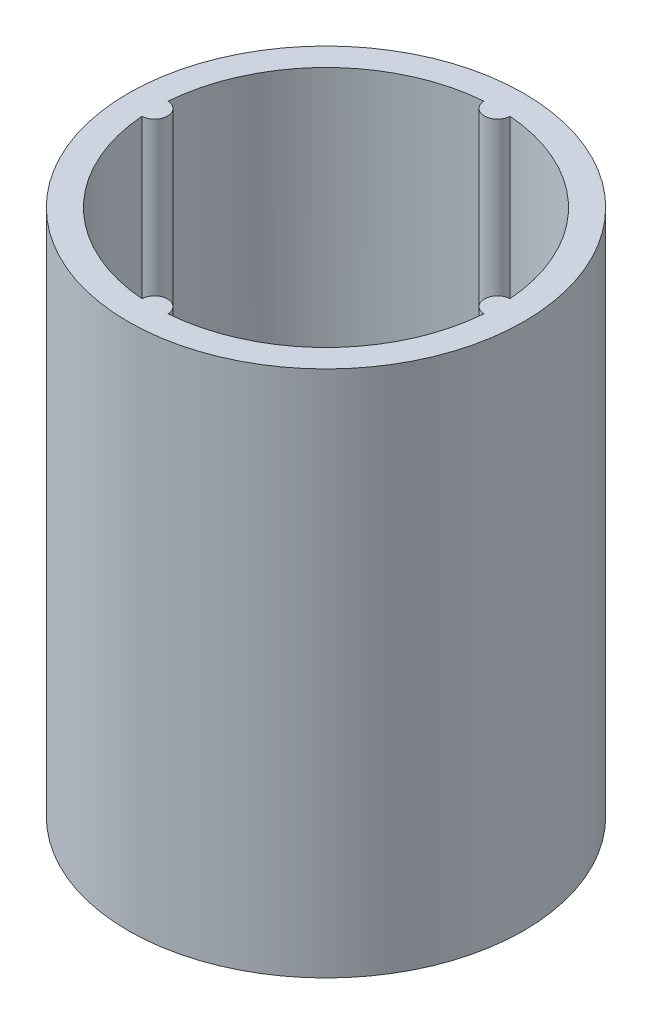
ISO-10303-21;
HEADER;
FILE_DESCRIPTION(('STEP AP214'),'2;1');
FILE_NAME('part.step','',(''),(''),'','','');
FILE_SCHEMA(('AUTOMOTIVE_DESIGN { 1 0 10303 214 1 1 1 1 }'));
ENDSEC;
DATA;
#1=APPLICATION_CONTEXT('core data for automotive mechanical design processes');
#2=APPLICATION_PROTOCOL_DEFINITION('international standard','automotive_design',2000,#1);
#3=PRODUCT_CONTEXT('',#1,'mechanical');
#4=PRODUCT('Part','Part','',(#3));
#5=PRODUCT_RELATED_PRODUCT_CATEGORY('part','',(#4));
#6=PRODUCT_DEFINITION_FORMATION('','',#4);
#7=PRODUCT_DEFINITION_CONTEXT('part definition',#1,'design');
#8=PRODUCT_DEFINITION('design','',#6,#7);
#9=PRODUCT_DEFINITION_SHAPE('','',#8);
#10=(LENGTH_UNIT() NAMED_UNIT(*) SI_UNIT(.MILLI.,.METRE.));
#11=(NAMED_UNIT(*) PLANE_ANGLE_UNIT() SI_UNIT($,.RADIAN.));
#12=(NAMED_UNIT(*) SI_UNIT($,.STERADIAN.) SOLID_ANGLE_UNIT());
#13=UNCERTAINTY_MEASURE_WITH_UNIT(LENGTH_MEASURE(1.E-05),#10,'distance_accuracy_value','');
#14=(GEOMETRIC_REPRESENTATION_CONTEXT(3) GLOBAL_UNCERTAINTY_ASSIGNED_CONTEXT((#13)) GLOBAL_UNIT_ASSIGNED_CONTEXT((#10,
#11,#12)) REPRESENTATION_CONTEXT('',''));
#15=CARTESIAN_POINT('',(0.,0.,0.));
#16=DIRECTION('',(0.,0.,1.));
#17=DIRECTION('',(1.,0.,0.));
#18=AXIS2_PLACEMENT_3D('',#15,#16,#17);
#19=CARTESIAN_POINT('',(0.,80.,0.));
#20=DIRECTION('',(0.,-1.,0.));
#21=DIRECTION('',(0.,0.,-1.));
#22=AXIS2_PLACEMENT_3D('',#19,#20,#21);
#23=CYLINDRICAL_SURFACE('',#22,30.);
#24=DIRECTION('',(0.,-1.,0.));
#25=VECTOR('',#24,1.);
#26=CARTESIAN_POINT('',(-22.3606797749979,80.,-20.));
#27=LINE('',#26,#25);
#28=CARTESIAN_POINT('',(-22.3606797749979,1.12434253433368,-20.));
#29=VERTEX_POINT('',#28);
#30=CARTESIAN_POINT('',(-22.3606797749979,11.1243425343337,-20.));
#31=VERTEX_POINT('',#30);
#32=EDGE_CURVE('E210',#29,#31,#27,.F.);
#33=ORIENTED_EDGE('',*,*,#32,.T.);
#34=CARTESIAN_POINT('',(0.,11.1243425343337,0.));
#35=DIRECTION('',(0.,1.,0.));
#36=DIRECTION('',(0.,0.,1.));
#37=AXIS2_PLACEMENT_3D('',#34,#35,#36);
#38=CIRCLE('',#37,30.);
#39=CARTESIAN_POINT('',(-22.3606797749979,11.1243425343337,20.));
#40=VERTEX_POINT('',#39);
#41=EDGE_CURVE('E213',#31,#40,#38,.T.);
#42=ORIENTED_EDGE('',*,*,#41,.T.);
#43=DIRECTION('',(0.,-1.,0.));
#44=VECTOR('',#43,1.);
#45=CARTESIAN_POINT('',(-22.3606797749979,80.,20.));
#46=LINE('',#45,#44);
#47=CARTESIAN_POINT('',(-22.3606797749979,1.12434253433367,20.));
#48=VERTEX_POINT('',#47);
#49=EDGE_CURVE('E204',#40,#48,#46,.T.);
#50=ORIENTED_EDGE('',*,*,#49,.T.);
#51=CARTESIAN_POINT('',(0.,1.12434253433368,0.));
#52=DIRECTION('',(0.,-1.,0.));
#53=DIRECTION('',(0.,0.,-1.));
#54=AXIS2_PLACEMENT_3D('',#51,#52,#53);
#55=CIRCLE('',#54,30.);
#56=EDGE_CURVE('E234',#48,#29,#55,.T.);
#57=ORIENTED_EDGE('',*,*,#56,.T.);
#58=EDGE_LOOP('',(#33,#42,#50,#57));
#59=FACE_BOUND('',#58,.T.);
#60=CARTESIAN_POINT('',(0.,80.,0.));
#61=DIRECTION('',(0.,1.,0.));
#62=DIRECTION('',(0.,0.,1.));
#63=AXIS2_PLACEMENT_3D('',#60,#61,#62);
#64=CIRCLE('',#63,30.);
#65=CARTESIAN_POINT('',(0.,80.,30.));
#66=VERTEX_POINT('',#65);
#67=EDGE_CURVE('E219',#66,#66,#64,.T.);
#68=ORIENTED_EDGE('',*,*,#67,.F.);
#69=EDGE_LOOP('',(#68));
#70=FACE_BOUND('',#69,.T.);
#71=CARTESIAN_POINT('',(0.,0.,0.));
#72=DIRECTION('',(0.,1.,0.));
#73=DIRECTION('',(0.,0.,1.));
#74=AXIS2_PLACEMENT_3D('',#71,#72,#73);
#75=CIRCLE('',#74,30.);
#76=CARTESIAN_POINT('',(0.,0.,30.));
#77=VERTEX_POINT('',#76);
#78=EDGE_CURVE('E217',#77,#77,#75,.T.);
#79=ORIENTED_EDGE('',*,*,#78,.T.);
#80=EDGE_LOOP('',(#79));
#81=FACE_BOUND('',#80,.T.);
#82=ADVANCED_FACE('F48',(#59,#70,#81),#23,.T.);
#83=CARTESIAN_POINT('',(0.,80.,0.));
#84=DIRECTION('',(0.,1.,0.));
#85=DIRECTION('',(0.,0.,1.));
#86=AXIS2_PLACEMENT_3D('',#83,#84,#85);
#87=PLANE('',#86);
#88=CARTESIAN_POINT('',(0.,80.,0.));
#89=DIRECTION('',(0.,1.,0.));
#90=DIRECTION('',(0.,0.,1.));
#91=AXIS2_PLACEMENT_3D('',#88,#89,#90);
#92=CIRCLE('',#91,26.0169193305463);
#93=CARTESIAN_POINT('',(-1.98163995735813,80.,-25.9413414173507));
#94=VERTEX_POINT('',#93);
#95=CARTESIAN_POINT('',(-25.9413414173507,80.,-1.98163995735804));
#96=VERTEX_POINT('',#95);
#97=EDGE_CURVE('E145',#94,#96,#92,.T.);
#98=ORIENTED_EDGE('',*,*,#97,.F.);
#99=CARTESIAN_POINT('',(0.,80.,-26.0169193305463));
#100=DIRECTION('',(0.,1.,0.));
#101=DIRECTION('',(0.,0.,1.));
#102=AXIS2_PLACEMENT_3D('',#99,#100,#101);
#103=CIRCLE('',#102,1.98308066945371);
#104=CARTESIAN_POINT('',(1.98163995735795,80.,-25.9413414173507));
#105=VERTEX_POINT('',#104);
#106=EDGE_CURVE('E149',#94,#105,#103,.T.);
#107=ORIENTED_EDGE('',*,*,#106,.T.);
#108=CARTESIAN_POINT('',(25.9413414173507,80.,-1.98163995735802));
#109=VERTEX_POINT('',#108);
#110=EDGE_CURVE('E153',#109,#105,#92,.T.);
#111=ORIENTED_EDGE('',*,*,#110,.F.);
#112=CARTESIAN_POINT('',(26.0169193305463,80.,0.));
#113=DIRECTION('',(0.,1.,0.));
#114=DIRECTION('',(0.,0.,1.));
#115=AXIS2_PLACEMENT_3D('',#112,#113,#114);
#116=CIRCLE('',#115,1.98308066945371);
#117=CARTESIAN_POINT('',(25.9413414173507,80.,1.98163995735806));
#118=VERTEX_POINT('',#117);
#119=EDGE_CURVE('E174',#109,#118,#116,.T.);
#120=ORIENTED_EDGE('',*,*,#119,.T.);
#121=CARTESIAN_POINT('',(1.98163995735805,80.,25.9413414173507));
#122=VERTEX_POINT('',#121);
#123=EDGE_CURVE('E156',#122,#118,#92,.T.);
#124=ORIENTED_EDGE('',*,*,#123,.F.);
#125=CARTESIAN_POINT('',(0.,80.,26.0169193305463));
#126=DIRECTION('',(0.,1.,0.));
#127=DIRECTION('',(0.,0.,1.));
#128=AXIS2_PLACEMENT_3D('',#125,#126,#127);
#129=CIRCLE('',#128,1.98308066945372);
#130=CARTESIAN_POINT('',(-1.98163995735805,80.,25.9413414173507));
#131=VERTEX_POINT('',#130);
#132=EDGE_CURVE('E166',#122,#131,#129,.T.);
#133=ORIENTED_EDGE('',*,*,#132,.T.);
#134=CARTESIAN_POINT('',(-25.9413414173507,80.,1.98163995735804));
#135=VERTEX_POINT('',#134);
#136=EDGE_CURVE('E154',#135,#131,#92,.T.);
#137=ORIENTED_EDGE('',*,*,#136,.F.);
#138=CARTESIAN_POINT('',(-26.0169193305463,80.,0.));
#139=DIRECTION('',(0.,1.,0.));
#140=DIRECTION('',(0.,0.,1.));
#141=AXIS2_PLACEMENT_3D('',#138,#139,#140);
#142=CIRCLE('',#141,1.98308066945371);
#143=EDGE_CURVE('E151',#135,#96,#142,.T.);
#144=ORIENTED_EDGE('',*,*,#143,.T.);
#145=EDGE_LOOP('',(#98,#107,#111,#120,#124,#133,#137,#144));
#146=FACE_BOUND('',#145,.T.);
#147=ORIENTED_EDGE('',*,*,#67,.T.);
#148=EDGE_LOOP('',(#147));
#149=FACE_BOUND('',#148,.T.);
#150=ADVANCED_FACE('F146',(#146,#149),#87,.T.);
#151=CARTESIAN_POINT('',(0.,0.,0.));
#152=DIRECTION('',(0.,1.,0.));
#153=DIRECTION('',(0.,0.,1.));
#154=AXIS2_PLACEMENT_3D('',#151,#152,#153);
#155=PLANE('',#154);
#156=ORIENTED_EDGE('',*,*,#78,.F.);
#157=EDGE_LOOP('',(#156));
#158=FACE_BOUND('',#157,.T.);
#159=ADVANCED_FACE('F276',(#158),#155,.F.);
#160=CARTESIAN_POINT('',(0.,5.,0.));
#161=DIRECTION('',(0.,1.,0.));
#162=DIRECTION('',(0.,0.,1.));
#163=AXIS2_PLACEMENT_3D('',#160,#161,#162);
#164=CYLINDRICAL_SURFACE('',#163,26.0169193305463);
#165=CARTESIAN_POINT('',(0.,11.1243425343337,0.));
#166=DIRECTION('',(0.,1.,0.));
#167=DIRECTION('',(0.,0.,1.));
#168=AXIS2_PLACEMENT_3D('',#165,#166,#167);
#169=CIRCLE('',#168,26.0169193305463);
#170=CARTESIAN_POINT('',(-16.6397142839699,11.1243425343337,20.));
#171=VERTEX_POINT('',#170);
#172=CARTESIAN_POINT('',(-16.6397142839699,11.1243425343337,-20.));
#173=VERTEX_POINT('',#172);
#174=EDGE_CURVE('E231',#171,#173,#169,.F.);
#175=ORIENTED_EDGE('',*,*,#174,.T.);
#176=DIRECTION('',(0.,1.,0.));
#177=VECTOR('',#176,1.);
#178=CARTESIAN_POINT('',(-16.6397142839699,5.,-20.));
#179=LINE('',#178,#177);
#180=CARTESIAN_POINT('',(-16.6397142839699,5.,-20.));
#181=VERTEX_POINT('',#180);
#182=EDGE_CURVE('E207',#173,#181,#179,.F.);
#183=ORIENTED_EDGE('',*,*,#182,.T.);
#184=CARTESIAN_POINT('',(0.,5.,0.));
#185=DIRECTION('',(0.,1.,0.));
#186=DIRECTION('',(0.,0.,1.));
#187=AXIS2_PLACEMENT_3D('',#184,#185,#186);
#188=CIRCLE('',#187,26.0169193305463);
#189=CARTESIAN_POINT('',(-16.6397142839699,5.,20.));
#190=VERTEX_POINT('',#189);
#191=EDGE_CURVE('E215',#190,#181,#188,.T.);
#192=ORIENTED_EDGE('',*,*,#191,.F.);
#193=DIRECTION('',(0.,1.,0.));
#194=VECTOR('',#193,1.);
#195=CARTESIAN_POINT('',(-16.6397142839699,5.,20.));
#196=LINE('',#195,#194);
#197=EDGE_CURVE('E194',#190,#171,#196,.T.);
#198=ORIENTED_EDGE('',*,*,#197,.T.);
#199=EDGE_LOOP('',(#175,#183,#192,#198));
#200=FACE_BOUND('',#199,.T.);
#201=CARTESIAN_POINT('',(0.,17.,0.));
#202=DIRECTION('',(0.,1.,0.));
#203=DIRECTION('',(0.,0.,1.));
#204=AXIS2_PLACEMENT_3D('',#201,#202,#203);
#205=CIRCLE('',#204,26.0169193305463);
#206=CARTESIAN_POINT('',(-1.98163995735813,17.,-25.9413414173507));
#207=VERTEX_POINT('',#206);
#208=CARTESIAN_POINT('',(1.98163995735795,17.,-25.9413414173507));
#209=VERTEX_POINT('',#208);
#210=EDGE_CURVE('E64',#207,#209,#205,.F.);
#211=ORIENTED_EDGE('',*,*,#210,.F.);
#212=DIRECTION('',(0.,1.,0.));
#213=VECTOR('',#212,1.);
#214=CARTESIAN_POINT('',(-1.98163995735813,48.5,-25.9413414173507));
#215=LINE('',#214,#213);
#216=EDGE_CURVE('E13',#207,#94,#215,.T.);
#217=ORIENTED_EDGE('',*,*,#216,.T.);
#218=ORIENTED_EDGE('',*,*,#97,.T.);
#219=DIRECTION('',(0.,1.,0.));
#220=VECTOR('',#219,1.);
#221=CARTESIAN_POINT('',(-25.9413414173507,48.5,-1.98163995735804));
#222=LINE('',#221,#220);
#223=CARTESIAN_POINT('',(-25.9413414173507,17.,-1.98163995735804));
#224=VERTEX_POINT('',#223);
#225=EDGE_CURVE('E248',#96,#224,#222,.F.);
#226=ORIENTED_EDGE('',*,*,#225,.T.);
#227=CARTESIAN_POINT('',(0.,17.,0.));
#228=DIRECTION('',(0.,1.,0.));
#229=DIRECTION('',(0.,0.,1.));
#230=AXIS2_PLACEMENT_3D('',#227,#228,#229);
#231=CIRCLE('',#230,26.0169193305463);
#232=CARTESIAN_POINT('',(-25.9413414173507,17.,1.98163995735804));
#233=VERTEX_POINT('',#232);
#234=EDGE_CURVE('E245',#233,#224,#231,.F.);
#235=ORIENTED_EDGE('',*,*,#234,.F.);
#236=DIRECTION('',(0.,1.,0.));
#237=VECTOR('',#236,1.);
#238=CARTESIAN_POINT('',(-25.9413414173507,48.5,1.98163995735804));
#239=LINE('',#238,#237);
#240=EDGE_CURVE('E250',#233,#135,#239,.T.);
#241=ORIENTED_EDGE('',*,*,#240,.T.);
#242=ORIENTED_EDGE('',*,*,#136,.T.);
#243=DIRECTION('',(0.,1.,0.));
#244=VECTOR('',#243,1.);
#245=CARTESIAN_POINT('',(-1.98163995735805,48.5,25.9413414173507));
#246=LINE('',#245,#244);
#247=CARTESIAN_POINT('',(-1.98163995735805,17.,25.9413414173507));
#248=VERTEX_POINT('',#247);
#249=EDGE_CURVE('E256',#131,#248,#246,.F.);
#250=ORIENTED_EDGE('',*,*,#249,.T.);
#251=CARTESIAN_POINT('',(0.,17.,0.));
#252=DIRECTION('',(0.,1.,0.));
#253=DIRECTION('',(0.,0.,1.));
#254=AXIS2_PLACEMENT_3D('',#251,#252,#253);
#255=CIRCLE('',#254,26.0169193305463);
#256=CARTESIAN_POINT('',(1.98163995735805,17.,25.9413414173507));
#257=VERTEX_POINT('',#256);
#258=EDGE_CURVE('E253',#257,#248,#255,.F.);
#259=ORIENTED_EDGE('',*,*,#258,.F.);
#260=DIRECTION('',(0.,1.,0.));
#261=VECTOR('',#260,1.);
#262=CARTESIAN_POINT('',(1.98163995735805,48.5,25.9413414173507));
#263=LINE('',#262,#261);
#264=EDGE_CURVE('E258',#257,#122,#263,.T.);
#265=ORIENTED_EDGE('',*,*,#264,.T.);
#266=ORIENTED_EDGE('',*,*,#123,.T.);
#267=DIRECTION('',(0.,1.,0.));
#268=VECTOR('',#267,1.);
#269=CARTESIAN_POINT('',(25.9413414173507,48.5,1.98163995735806));
#270=LINE('',#269,#268);
#271=CARTESIAN_POINT('',(25.9413414173507,17.,1.98163995735806));
#272=VERTEX_POINT('',#271);
#273=EDGE_CURVE('E240',#118,#272,#270,.F.);
#274=ORIENTED_EDGE('',*,*,#273,.T.);
#275=CARTESIAN_POINT('',(0.,17.,0.));
#276=DIRECTION('',(0.,1.,0.));
#277=DIRECTION('',(0.,0.,1.));
#278=AXIS2_PLACEMENT_3D('',#275,#276,#277);
#279=CIRCLE('',#278,26.0169193305463);
#280=CARTESIAN_POINT('',(25.9413414173507,17.,-1.98163995735802));
#281=VERTEX_POINT('',#280);
#282=EDGE_CURVE('E237',#281,#272,#279,.F.);
#283=ORIENTED_EDGE('',*,*,#282,.F.);
#284=DIRECTION('',(0.,1.,0.));
#285=VECTOR('',#284,1.);
#286=CARTESIAN_POINT('',(25.9413414173507,48.5,-1.98163995735802));
#287=LINE('',#286,#285);
#288=EDGE_CURVE('E242',#281,#109,#287,.T.);
#289=ORIENTED_EDGE('',*,*,#288,.T.);
#290=ORIENTED_EDGE('',*,*,#110,.T.);
#291=DIRECTION('',(0.,1.,0.));
#292=VECTOR('',#291,1.);
#293=CARTESIAN_POINT('',(1.98163995735795,48.5,-25.9413414173507));
#294=LINE('',#293,#292);
#295=EDGE_CURVE('E55',#105,#209,#294,.F.);
#296=ORIENTED_EDGE('',*,*,#295,.T.);
#297=EDGE_LOOP('',(#211,#217,#218,#226,#235,#241,#242,#250,#259,#265,#266,#274,#283,#289,#290,#296));
#298=FACE_BOUND('',#297,.T.);
#299=ADVANCED_FACE('F157',(#200,#298),#164,.F.);
#300=CARTESIAN_POINT('',(0.,5.,0.));
#301=DIRECTION('',(0.,1.,0.));
#302=DIRECTION('',(0.,0.,1.));
#303=AXIS2_PLACEMENT_3D('',#300,#301,#302);
#304=PLANE('',#303);
#305=DIRECTION('',(-1.,0.,0.));
#306=VECTOR('',#305,1.);
#307=CARTESIAN_POINT('',(0.,5.,-20.));
#308=LINE('',#307,#306);
#309=CARTESIAN_POINT('',(0.,5.,-20.));
#310=VERTEX_POINT('',#309);
#311=EDGE_CURVE('E229',#310,#181,#308,.T.);
#312=ORIENTED_EDGE('',*,*,#311,.F.);
#313=DIRECTION('',(0.,0.,-1.));
#314=VECTOR('',#313,1.);
#315=CARTESIAN_POINT('',(0.,5.,0.));
#316=LINE('',#315,#314);
#317=CARTESIAN_POINT('',(0.,5.,20.));
#318=VERTEX_POINT('',#317);
#319=EDGE_CURVE('E222',#318,#310,#316,.T.);
#320=ORIENTED_EDGE('',*,*,#319,.F.);
#321=DIRECTION('',(1.,0.,0.));
#322=VECTOR('',#321,1.);
#323=CARTESIAN_POINT('',(0.,5.,20.));
#324=LINE('',#323,#322);
#325=EDGE_CURVE('E226',#190,#318,#324,.T.);
#326=ORIENTED_EDGE('',*,*,#325,.F.);
#327=ORIENTED_EDGE('',*,*,#191,.T.);
#328=EDGE_LOOP('',(#312,#320,#326,#327));
#329=FACE_BOUND('',#328,.T.);
#330=ADVANCED_FACE('F287',(#329),#304,.T.);
#331=CARTESIAN_POINT('',(-30.,1.12434253433367,20.));
#332=DIRECTION('',(0.,-1.,0.));
#333=DIRECTION('',(0.,0.,-1.));
#334=AXIS2_PLACEMENT_3D('',#331,#332,#333);
#335=PLANE('',#334);
#336=DIRECTION('',(1.,0.,0.));
#337=VECTOR('',#336,1.);
#338=CARTESIAN_POINT('',(-30.,1.12434253433367,20.));
#339=LINE('',#338,#337);
#340=CARTESIAN_POINT('',(0.,1.12434253433367,20.));
#341=VERTEX_POINT('',#340);
#342=EDGE_CURVE('E195',#48,#341,#339,.T.);
#343=ORIENTED_EDGE('',*,*,#342,.T.);
#344=DIRECTION('',(0.,0.,-1.));
#345=VECTOR('',#344,1.);
#346=CARTESIAN_POINT('',(0.,1.12434253433367,20.));
#347=LINE('',#346,#345);
#348=CARTESIAN_POINT('',(0.,1.12434253433367,-20.));
#349=VERTEX_POINT('',#348);
#350=EDGE_CURVE('E188',#341,#349,#347,.T.);
#351=ORIENTED_EDGE('',*,*,#350,.T.);
#352=DIRECTION('',(1.,0.,0.));
#353=VECTOR('',#352,1.);
#354=CARTESIAN_POINT('',(-30.,1.12434253433367,-20.));
#355=LINE('',#354,#353);
#356=EDGE_CURVE('E192',#29,#349,#355,.T.);
#357=ORIENTED_EDGE('',*,*,#356,.F.);
#358=ORIENTED_EDGE('',*,*,#56,.F.);
#359=EDGE_LOOP('',(#343,#351,#357,#358));
#360=FACE_BOUND('',#359,.T.);
#361=ADVANCED_FACE('F293',(#360),#335,.F.);
#362=CARTESIAN_POINT('',(-30.,11.1243425343337,20.));
#363=DIRECTION('',(0.,1.,0.));
#364=DIRECTION('',(0.,0.,1.));
#365=AXIS2_PLACEMENT_3D('',#362,#363,#364);
#366=PLANE('',#365);
#367=DIRECTION('',(1.,0.,0.));
#368=VECTOR('',#367,1.);
#369=CARTESIAN_POINT('',(-30.,11.1243425343337,-20.));
#370=LINE('',#369,#368);
#371=EDGE_CURVE('E191',#31,#173,#370,.T.);
#372=ORIENTED_EDGE('',*,*,#371,.T.);
#373=ORIENTED_EDGE('',*,*,#174,.F.);
#374=DIRECTION('',(1.,0.,0.));
#375=VECTOR('',#374,1.);
#376=CARTESIAN_POINT('',(-30.,11.1243425343337,20.));
#377=LINE('',#376,#375);
#378=EDGE_CURVE('E197',#40,#171,#377,.T.);
#379=ORIENTED_EDGE('',*,*,#378,.F.);
#380=ORIENTED_EDGE('',*,*,#41,.F.);
#381=EDGE_LOOP('',(#372,#373,#379,#380));
#382=FACE_BOUND('',#381,.T.);
#383=ADVANCED_FACE('F299',(#382),#366,.F.);
#384=CARTESIAN_POINT('',(-30.,11.1243425343337,-20.));
#385=DIRECTION('',(0.,0.,-1.));
#386=DIRECTION('',(-1.,0.,0.));
#387=AXIS2_PLACEMENT_3D('',#384,#385,#386);
#388=PLANE('',#387);
#389=ORIENTED_EDGE('',*,*,#356,.T.);
#390=DIRECTION('',(0.,1.,0.));
#391=VECTOR('',#390,1.);
#392=CARTESIAN_POINT('',(0.,11.1243425343337,-20.));
#393=LINE('',#392,#391);
#394=EDGE_CURVE('E180',#349,#310,#393,.T.);
#395=ORIENTED_EDGE('',*,*,#394,.T.);
#396=ORIENTED_EDGE('',*,*,#311,.T.);
#397=ORIENTED_EDGE('',*,*,#182,.F.);
#398=ORIENTED_EDGE('',*,*,#371,.F.);
#399=ORIENTED_EDGE('',*,*,#32,.F.);
#400=EDGE_LOOP('',(#389,#395,#396,#397,#398,#399));
#401=FACE_BOUND('',#400,.T.);
#402=ADVANCED_FACE('F295',(#401),#388,.F.);
#403=CARTESIAN_POINT('',(-30.,11.1243425343337,20.));
#404=DIRECTION('',(0.,0.,1.));
#405=DIRECTION('',(1.,0.,0.));
#406=AXIS2_PLACEMENT_3D('',#403,#404,#405);
#407=PLANE('',#406);
#408=ORIENTED_EDGE('',*,*,#378,.T.);
#409=ORIENTED_EDGE('',*,*,#197,.F.);
#410=ORIENTED_EDGE('',*,*,#325,.T.);
#411=DIRECTION('',(0.,-1.,0.));
#412=VECTOR('',#411,1.);
#413=CARTESIAN_POINT('',(0.,11.1243425343337,20.));
#414=LINE('',#413,#412);
#415=EDGE_CURVE('E185',#318,#341,#414,.T.);
#416=ORIENTED_EDGE('',*,*,#415,.T.);
#417=ORIENTED_EDGE('',*,*,#342,.F.);
#418=ORIENTED_EDGE('',*,*,#49,.F.);
#419=EDGE_LOOP('',(#408,#409,#410,#416,#417,#418));
#420=FACE_BOUND('',#419,.T.);
#421=ADVANCED_FACE('F298',(#420),#407,.F.);
#422=CARTESIAN_POINT('',(0.,0.,0.));
#423=DIRECTION('',(1.,0.,0.));
#424=DIRECTION('',(0.,0.,-1.));
#425=AXIS2_PLACEMENT_3D('',#422,#423,#424);
#426=PLANE('',#425);
#427=ORIENTED_EDGE('',*,*,#319,.T.);
#428=ORIENTED_EDGE('',*,*,#394,.F.);
#429=ORIENTED_EDGE('',*,*,#350,.F.);
#430=ORIENTED_EDGE('',*,*,#415,.F.);
#431=EDGE_LOOP('',(#427,#428,#429,#430));
#432=FACE_BOUND('',#431,.T.);
#433=ADVANCED_FACE('F306',(#432),#426,.F.);
#434=CARTESIAN_POINT('',(26.0169193305463,17.,0.));
#435=DIRECTION('',(0.,1.,0.));
#436=DIRECTION('',(0.,0.,1.));
#437=AXIS2_PLACEMENT_3D('',#434,#435,#436);
#438=CYLINDRICAL_SURFACE('',#437,1.98308066945371);
#439=ORIENTED_EDGE('',*,*,#288,.F.);
#440=CARTESIAN_POINT('',(26.0169193305463,17.,0.));
#441=DIRECTION('',(0.,1.,0.));
#442=DIRECTION('',(0.,0.,1.));
#443=AXIS2_PLACEMENT_3D('',#440,#441,#442);
#444=CIRCLE('',#443,1.98308066945371);
#445=EDGE_CURVE('E177',#281,#272,#444,.T.);
#446=ORIENTED_EDGE('',*,*,#445,.T.);
#447=ORIENTED_EDGE('',*,*,#273,.F.);
#448=ORIENTED_EDGE('',*,*,#119,.F.);
#449=EDGE_LOOP('',(#439,#446,#447,#448));
#450=FACE_BOUND('',#449,.T.);
#451=ADVANCED_FACE('F313',(#450),#438,.T.);
#452=CARTESIAN_POINT('',(26.0169193305463,17.,0.));
#453=DIRECTION('',(0.,1.,0.));
#454=DIRECTION('',(0.,0.,1.));
#455=AXIS2_PLACEMENT_3D('',#452,#453,#454);
#456=PLANE('',#455);
#457=ORIENTED_EDGE('',*,*,#445,.F.);
#458=ORIENTED_EDGE('',*,*,#282,.T.);
#459=EDGE_LOOP('',(#457,#458));
#460=FACE_BOUND('',#459,.T.);
#461=ADVANCED_FACE('F317',(#460),#456,.F.);
#462=CARTESIAN_POINT('',(-26.0169193305463,17.,0.));
#463=DIRECTION('',(0.,1.,0.));
#464=DIRECTION('',(0.,0.,1.));
#465=AXIS2_PLACEMENT_3D('',#462,#463,#464);
#466=CYLINDRICAL_SURFACE('',#465,1.98308066945371);
#467=ORIENTED_EDGE('',*,*,#240,.F.);
#468=CARTESIAN_POINT('',(-26.0169193305463,17.,0.));
#469=DIRECTION('',(0.,1.,0.));
#470=DIRECTION('',(0.,0.,1.));
#471=AXIS2_PLACEMENT_3D('',#468,#469,#470);
#472=CIRCLE('',#471,1.98308066945371);
#473=EDGE_CURVE('E171',#233,#224,#472,.T.);
#474=ORIENTED_EDGE('',*,*,#473,.T.);
#475=ORIENTED_EDGE('',*,*,#225,.F.);
#476=ORIENTED_EDGE('',*,*,#143,.F.);
#477=EDGE_LOOP('',(#467,#474,#475,#476));
#478=FACE_BOUND('',#477,.T.);
#479=ADVANCED_FACE('F321',(#478),#466,.T.);
#480=CARTESIAN_POINT('',(-26.0169193305463,17.,0.));
#481=DIRECTION('',(0.,1.,0.));
#482=DIRECTION('',(0.,0.,1.));
#483=AXIS2_PLACEMENT_3D('',#480,#481,#482);
#484=PLANE('',#483);
#485=ORIENTED_EDGE('',*,*,#473,.F.);
#486=ORIENTED_EDGE('',*,*,#234,.T.);
#487=EDGE_LOOP('',(#485,#486));
#488=FACE_BOUND('',#487,.T.);
#489=ADVANCED_FACE('F323',(#488),#484,.F.);
#490=CARTESIAN_POINT('',(0.,17.,26.0169193305463));
#491=DIRECTION('',(0.,1.,0.));
#492=DIRECTION('',(0.,0.,1.));
#493=AXIS2_PLACEMENT_3D('',#490,#491,#492);
#494=CYLINDRICAL_SURFACE('',#493,1.98308066945372);
#495=ORIENTED_EDGE('',*,*,#264,.F.);
#496=CARTESIAN_POINT('',(0.,17.,26.0169193305463));
#497=DIRECTION('',(0.,1.,0.));
#498=DIRECTION('',(0.,0.,1.));
#499=AXIS2_PLACEMENT_3D('',#496,#497,#498);
#500=CIRCLE('',#499,1.98308066945372);
#501=EDGE_CURVE('E162',#257,#248,#500,.T.);
#502=ORIENTED_EDGE('',*,*,#501,.T.);
#503=ORIENTED_EDGE('',*,*,#249,.F.);
#504=ORIENTED_EDGE('',*,*,#132,.F.);
#505=EDGE_LOOP('',(#495,#502,#503,#504));
#506=FACE_BOUND('',#505,.T.);
#507=ADVANCED_FACE('F326',(#506),#494,.T.);
#508=CARTESIAN_POINT('',(0.,17.,26.0169193305463));
#509=DIRECTION('',(0.,1.,0.));
#510=DIRECTION('',(0.,0.,1.));
#511=AXIS2_PLACEMENT_3D('',#508,#509,#510);
#512=PLANE('',#511);
#513=ORIENTED_EDGE('',*,*,#501,.F.);
#514=ORIENTED_EDGE('',*,*,#258,.T.);
#515=EDGE_LOOP('',(#513,#514));
#516=FACE_BOUND('',#515,.T.);
#517=ADVANCED_FACE('F268',(#516),#512,.F.);
#518=CARTESIAN_POINT('',(0.,17.,-26.0169193305463));
#519=DIRECTION('',(0.,1.,0.));
#520=DIRECTION('',(0.,0.,1.));
#521=AXIS2_PLACEMENT_3D('',#518,#519,#520);
#522=CYLINDRICAL_SURFACE('',#521,1.98308066945371);
#523=ORIENTED_EDGE('',*,*,#216,.F.);
#524=CARTESIAN_POINT('',(0.,17.,-26.0169193305463));
#525=DIRECTION('',(0.,1.,0.));
#526=DIRECTION('',(0.,0.,1.));
#527=AXIS2_PLACEMENT_3D('',#524,#525,#526);
#528=CIRCLE('',#527,1.98308066945371);
#529=EDGE_CURVE('E163',#207,#209,#528,.T.);
#530=ORIENTED_EDGE('',*,*,#529,.T.);
#531=ORIENTED_EDGE('',*,*,#295,.F.);
#532=ORIENTED_EDGE('',*,*,#106,.F.);
#533=EDGE_LOOP('',(#523,#530,#531,#532));
#534=FACE_BOUND('',#533,.T.);
#535=ADVANCED_FACE('F161',(#534),#522,.T.);
#536=CARTESIAN_POINT('',(0.,17.,-26.0169193305463));
#537=DIRECTION('',(0.,1.,0.));
#538=DIRECTION('',(0.,0.,1.));
#539=AXIS2_PLACEMENT_3D('',#536,#537,#538);
#540=PLANE('',#539);
#541=ORIENTED_EDGE('',*,*,#529,.F.);
#542=ORIENTED_EDGE('',*,*,#210,.T.);
#543=EDGE_LOOP('',(#541,#542));
#544=FACE_BOUND('',#543,.T.);
#545=ADVANCED_FACE('F262',(#544),#540,.F.);
#546=CLOSED_SHELL('',(#82,#150,#159,#299,#330,#361,#383,#402,#421,#433,#451,#461,#479,#489,#507,
#517,#535,#545));
#547=MANIFOLD_SOLID_BREP('B2',#546);
#548=ADVANCED_BREP_SHAPE_REPRESENTATION('',(#18,#547),#14);
#549=SHAPE_DEFINITION_REPRESENTATION(#9,#548);
ENDSEC;
END-ISO-10303-21;
